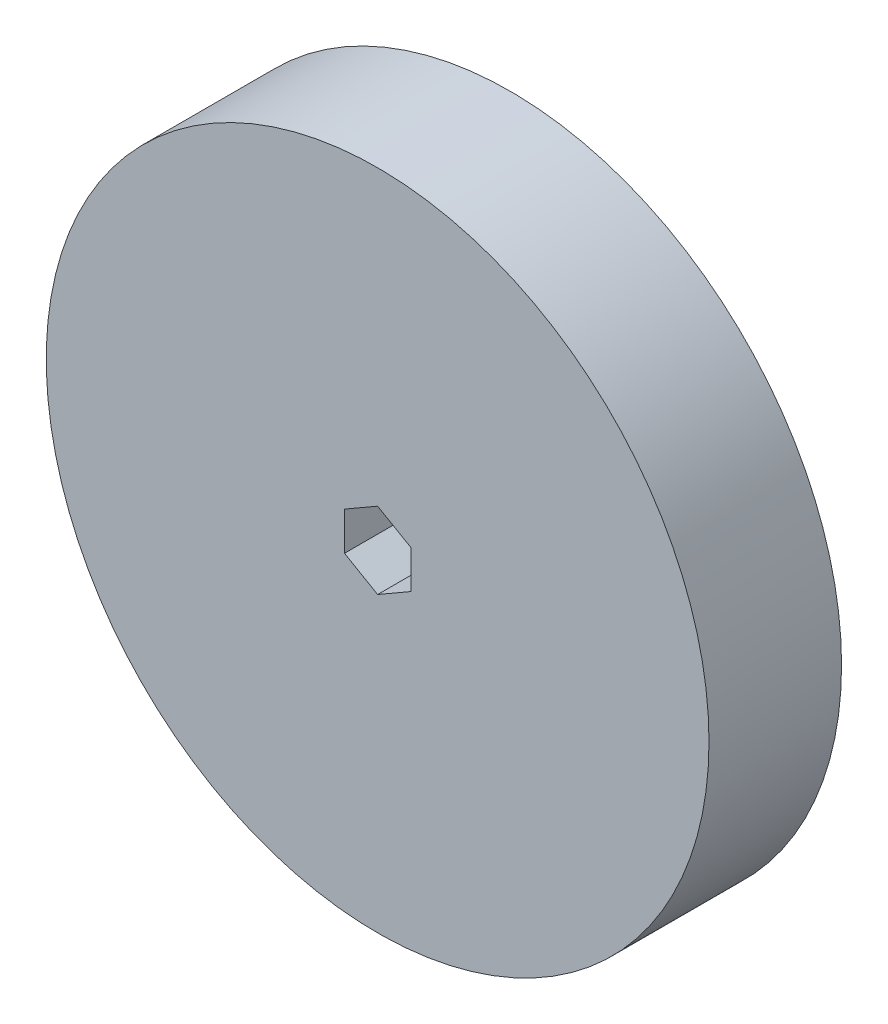
ISO-10303-21;
HEADER;
FILE_DESCRIPTION(('STEP AP214'),'2;1');
FILE_NAME('part.step','',(''),(''),'','','');
FILE_SCHEMA(('AUTOMOTIVE_DESIGN { 1 0 10303 214 1 1 1 1 }'));
ENDSEC;
DATA;
#1=APPLICATION_CONTEXT('core data for automotive mechanical design processes');
#2=APPLICATION_PROTOCOL_DEFINITION('international standard','automotive_design',2000,#1);
#3=PRODUCT_CONTEXT('',#1,'mechanical');
#4=PRODUCT('Part','Part','',(#3));
#5=PRODUCT_RELATED_PRODUCT_CATEGORY('part','',(#4));
#6=PRODUCT_DEFINITION_FORMATION('','',#4);
#7=PRODUCT_DEFINITION_CONTEXT('part definition',#1,'design');
#8=PRODUCT_DEFINITION('design','',#6,#7);
#9=PRODUCT_DEFINITION_SHAPE('','',#8);
#10=(LENGTH_UNIT() NAMED_UNIT(*) SI_UNIT(.MILLI.,.METRE.));
#11=(NAMED_UNIT(*) PLANE_ANGLE_UNIT() SI_UNIT($,.RADIAN.));
#12=(NAMED_UNIT(*) SI_UNIT($,.STERADIAN.) SOLID_ANGLE_UNIT());
#13=UNCERTAINTY_MEASURE_WITH_UNIT(LENGTH_MEASURE(1.E-05),#10,'distance_accuracy_value','');
#14=(GEOMETRIC_REPRESENTATION_CONTEXT(3) GLOBAL_UNCERTAINTY_ASSIGNED_CONTEXT((#13)) GLOBAL_UNIT_ASSIGNED_CONTEXT((#10,
#11,#12)) REPRESENTATION_CONTEXT('',''));
#15=CARTESIAN_POINT('',(0.,0.,0.));
#16=DIRECTION('',(0.,0.,1.));
#17=DIRECTION('',(1.,0.,0.));
#18=AXIS2_PLACEMENT_3D('',#15,#16,#17);
#19=CARTESIAN_POINT('',(0.,0.,25.4));
#20=DIRECTION('',(0.,0.,1.));
#21=DIRECTION('',(1.,0.,0.));
#22=AXIS2_PLACEMENT_3D('',#19,#20,#21);
#23=PLANE('',#22);
#24=CARTESIAN_POINT('',(0.,0.,25.4));
#25=DIRECTION('',(0.,0.,1.));
#26=DIRECTION('',(1.,0.,0.));
#27=AXIS2_PLACEMENT_3D('',#24,#25,#26);
#28=CIRCLE('',#27,63.5);
#29=CARTESIAN_POINT('',(63.5,0.,25.4));
#30=VERTEX_POINT('',#29);
#31=EDGE_CURVE('E11',#30,#30,#28,.T.);
#32=ORIENTED_EDGE('',*,*,#31,.T.);
#33=EDGE_LOOP('',(#32));
#34=FACE_BOUND('',#33,.T.);
#35=DIRECTION('',(-0.866025403784438,-0.5,0.));
#36=VECTOR('',#35,1.);
#37=CARTESIAN_POINT('',(0.,7.33234841870825,25.4));
#38=LINE('',#37,#36);
#39=CARTESIAN_POINT('',(0.,7.33234841870825,25.4));
#40=VERTEX_POINT('',#39);
#41=CARTESIAN_POINT('',(-6.34999999999999,3.66617420935413,25.4));
#42=VERTEX_POINT('',#41);
#43=EDGE_CURVE('E102',#40,#42,#38,.T.);
#44=ORIENTED_EDGE('',*,*,#43,.F.);
#45=DIRECTION('',(-0.866025403784439,0.5,0.));
#46=VECTOR('',#45,1.);
#47=CARTESIAN_POINT('',(6.34999999999997,3.66617420935414,25.4));
#48=LINE('',#47,#46);
#49=CARTESIAN_POINT('',(6.34999999999997,3.66617420935414,25.4));
#50=VERTEX_POINT('',#49);
#51=EDGE_CURVE('E93',#50,#40,#48,.T.);
#52=ORIENTED_EDGE('',*,*,#51,.F.);
#53=DIRECTION('',(0.,1.,0.));
#54=VECTOR('',#53,1.);
#55=CARTESIAN_POINT('',(6.34999999999998,-3.66617420935413,25.4));
#56=LINE('',#55,#54);
#57=CARTESIAN_POINT('',(6.34999999999998,-3.66617420935413,25.4));
#58=VERTEX_POINT('',#57);
#59=EDGE_CURVE('E127',#58,#50,#56,.T.);
#60=ORIENTED_EDGE('',*,*,#59,.F.);
#61=DIRECTION('',(0.866025403784439,0.5,0.));
#62=VECTOR('',#61,1.);
#63=CARTESIAN_POINT('',(0.,-7.33234841870824,25.4));
#64=LINE('',#63,#62);
#65=CARTESIAN_POINT('',(0.,-7.33234841870824,25.4));
#66=VERTEX_POINT('',#65);
#67=EDGE_CURVE('E124',#66,#58,#64,.T.);
#68=ORIENTED_EDGE('',*,*,#67,.F.);
#69=DIRECTION('',(0.866025403784439,-0.5,0.));
#70=VECTOR('',#69,1.);
#71=CARTESIAN_POINT('',(-6.34999999999999,-3.66617420935413,25.4));
#72=LINE('',#71,#70);
#73=CARTESIAN_POINT('',(-6.34999999999999,-3.66617420935413,25.4));
#74=VERTEX_POINT('',#73);
#75=EDGE_CURVE('E119',#74,#66,#72,.T.);
#76=ORIENTED_EDGE('',*,*,#75,.F.);
#77=DIRECTION('',(0.,-1.,0.));
#78=VECTOR('',#77,1.);
#79=CARTESIAN_POINT('',(-6.34999999999999,3.66617420935413,25.4));
#80=LINE('',#79,#78);
#81=EDGE_CURVE('E115',#42,#74,#80,.T.);
#82=ORIENTED_EDGE('',*,*,#81,.F.);
#83=EDGE_LOOP('',(#44,#52,#60,#68,#76,#82));
#84=FACE_BOUND('',#83,.T.);
#85=ADVANCED_FACE('F39',(#34,#84),#23,.T.);
#86=CARTESIAN_POINT('',(0.,0.,0.));
#87=DIRECTION('',(0.,0.,1.));
#88=DIRECTION('',(1.,0.,0.));
#89=AXIS2_PLACEMENT_3D('',#86,#87,#88);
#90=PLANE('',#89);
#91=CARTESIAN_POINT('',(0.,0.,0.));
#92=DIRECTION('',(0.,0.,1.));
#93=DIRECTION('',(1.,0.,0.));
#94=AXIS2_PLACEMENT_3D('',#91,#92,#93);
#95=CIRCLE('',#94,63.5);
#96=CARTESIAN_POINT('',(63.5,0.,0.));
#97=VERTEX_POINT('',#96);
#98=EDGE_CURVE('E43',#97,#97,#95,.T.);
#99=ORIENTED_EDGE('',*,*,#98,.F.);
#100=EDGE_LOOP('',(#99));
#101=FACE_BOUND('',#100,.T.);
#102=DIRECTION('',(-0.866025403784439,0.5,0.));
#103=VECTOR('',#102,1.);
#104=CARTESIAN_POINT('',(6.34999999999997,3.66617420935414,0.));
#105=LINE('',#104,#103);
#106=CARTESIAN_POINT('',(6.34999999999997,3.66617420935414,0.));
#107=VERTEX_POINT('',#106);
#108=CARTESIAN_POINT('',(0.,7.33234841870825,0.));
#109=VERTEX_POINT('',#108);
#110=EDGE_CURVE('E63',#107,#109,#105,.T.);
#111=ORIENTED_EDGE('',*,*,#110,.T.);
#112=DIRECTION('',(-0.866025403784438,-0.5,0.));
#113=VECTOR('',#112,1.);
#114=CARTESIAN_POINT('',(0.,7.33234841870825,0.));
#115=LINE('',#114,#113);
#116=CARTESIAN_POINT('',(-6.34999999999999,3.66617420935413,0.));
#117=VERTEX_POINT('',#116);
#118=EDGE_CURVE('E109',#109,#117,#115,.T.);
#119=ORIENTED_EDGE('',*,*,#118,.T.);
#120=DIRECTION('',(0.,-1.,0.));
#121=VECTOR('',#120,1.);
#122=CARTESIAN_POINT('',(-6.34999999999999,3.66617420935413,0.));
#123=LINE('',#122,#121);
#124=CARTESIAN_POINT('',(-6.34999999999999,-3.66617420935413,0.));
#125=VERTEX_POINT('',#124);
#126=EDGE_CURVE('E134',#117,#125,#123,.T.);
#127=ORIENTED_EDGE('',*,*,#126,.T.);
#128=DIRECTION('',(0.866025403784439,-0.5,0.));
#129=VECTOR('',#128,1.);
#130=CARTESIAN_POINT('',(-6.34999999999999,-3.66617420935413,0.));
#131=LINE('',#130,#129);
#132=CARTESIAN_POINT('',(0.,-7.33234841870824,0.));
#133=VERTEX_POINT('',#132);
#134=EDGE_CURVE('E138',#125,#133,#131,.T.);
#135=ORIENTED_EDGE('',*,*,#134,.T.);
#136=DIRECTION('',(0.866025403784439,0.5,0.));
#137=VECTOR('',#136,1.);
#138=CARTESIAN_POINT('',(0.,-7.33234841870824,0.));
#139=LINE('',#138,#137);
#140=CARTESIAN_POINT('',(6.34999999999998,-3.66617420935413,0.));
#141=VERTEX_POINT('',#140);
#142=EDGE_CURVE('E142',#133,#141,#139,.T.);
#143=ORIENTED_EDGE('',*,*,#142,.T.);
#144=DIRECTION('',(0.,1.,0.));
#145=VECTOR('',#144,1.);
#146=CARTESIAN_POINT('',(6.34999999999998,-3.66617420935413,0.));
#147=LINE('',#146,#145);
#148=EDGE_CURVE('E103',#141,#107,#147,.T.);
#149=ORIENTED_EDGE('',*,*,#148,.T.);
#150=EDGE_LOOP('',(#111,#119,#127,#135,#143,#149));
#151=FACE_BOUND('',#150,.T.);
#152=ADVANCED_FACE('F166',(#101,#151),#90,.F.);
#153=CARTESIAN_POINT('',(0.,0.,25.4));
#154=DIRECTION('',(0.,0.,-1.));
#155=DIRECTION('',(-1.,0.,0.));
#156=AXIS2_PLACEMENT_3D('',#153,#154,#155);
#157=CYLINDRICAL_SURFACE('',#156,63.5);
#158=ORIENTED_EDGE('',*,*,#31,.F.);
#159=EDGE_LOOP('',(#158));
#160=FACE_BOUND('',#159,.T.);
#161=ORIENTED_EDGE('',*,*,#98,.T.);
#162=EDGE_LOOP('',(#161));
#163=FACE_BOUND('',#162,.T.);
#164=ADVANCED_FACE('F41',(#160,#163),#157,.T.);
#165=CARTESIAN_POINT('',(6.34999999999997,3.66617420935414,25.4));
#166=DIRECTION('',(-0.5,-0.866025403784439,0.));
#167=DIRECTION('',(0.866025403784439,-0.5,0.));
#168=AXIS2_PLACEMENT_3D('',#165,#166,#167);
#169=PLANE('',#168);
#170=ORIENTED_EDGE('',*,*,#110,.F.);
#171=DIRECTION('',(0.,0.,-1.));
#172=VECTOR('',#171,1.);
#173=CARTESIAN_POINT('',(6.34999999999997,3.66617420935414,25.4));
#174=LINE('',#173,#172);
#175=EDGE_CURVE('E97',#50,#107,#174,.T.);
#176=ORIENTED_EDGE('',*,*,#175,.F.);
#177=ORIENTED_EDGE('',*,*,#51,.T.);
#178=DIRECTION('',(0.,0.,-1.));
#179=VECTOR('',#178,1.);
#180=CARTESIAN_POINT('',(0.,7.33234841870825,25.4));
#181=LINE('',#180,#179);
#182=EDGE_CURVE('E96',#40,#109,#181,.T.);
#183=ORIENTED_EDGE('',*,*,#182,.T.);
#184=EDGE_LOOP('',(#170,#176,#177,#183));
#185=FACE_BOUND('',#184,.T.);
#186=ADVANCED_FACE('F95',(#185),#169,.T.);
#187=CARTESIAN_POINT('',(0.,7.33234841870825,25.4));
#188=DIRECTION('',(0.5,-0.866025403784438,0.));
#189=DIRECTION('',(0.866025403784438,0.5,0.));
#190=AXIS2_PLACEMENT_3D('',#187,#188,#189);
#191=PLANE('',#190);
#192=ORIENTED_EDGE('',*,*,#118,.F.);
#193=ORIENTED_EDGE('',*,*,#182,.F.);
#194=ORIENTED_EDGE('',*,*,#43,.T.);
#195=DIRECTION('',(0.,0.,-1.));
#196=VECTOR('',#195,1.);
#197=CARTESIAN_POINT('',(-6.34999999999999,3.66617420935413,25.4));
#198=LINE('',#197,#196);
#199=EDGE_CURVE('E111',#42,#117,#198,.T.);
#200=ORIENTED_EDGE('',*,*,#199,.T.);
#201=EDGE_LOOP('',(#192,#193,#194,#200));
#202=FACE_BOUND('',#201,.T.);
#203=ADVANCED_FACE('F106',(#202),#191,.T.);
#204=CARTESIAN_POINT('',(-6.34999999999999,3.66617420935413,25.4));
#205=DIRECTION('',(1.,0.,0.));
#206=DIRECTION('',(0.,1.,0.));
#207=AXIS2_PLACEMENT_3D('',#204,#205,#206);
#208=PLANE('',#207);
#209=ORIENTED_EDGE('',*,*,#126,.F.);
#210=ORIENTED_EDGE('',*,*,#199,.F.);
#211=ORIENTED_EDGE('',*,*,#81,.T.);
#212=DIRECTION('',(0.,0.,-1.));
#213=VECTOR('',#212,1.);
#214=CARTESIAN_POINT('',(-6.34999999999999,-3.66617420935413,25.4));
#215=LINE('',#214,#213);
#216=EDGE_CURVE('E156',#74,#125,#215,.T.);
#217=ORIENTED_EDGE('',*,*,#216,.T.);
#218=EDGE_LOOP('',(#209,#210,#211,#217));
#219=FACE_BOUND('',#218,.T.);
#220=ADVANCED_FACE('F162',(#219),#208,.T.);
#221=CARTESIAN_POINT('',(-6.34999999999999,-3.66617420935413,25.4));
#222=DIRECTION('',(0.5,0.866025403784439,0.));
#223=DIRECTION('',(-0.866025403784439,0.5,0.));
#224=AXIS2_PLACEMENT_3D('',#221,#222,#223);
#225=PLANE('',#224);
#226=ORIENTED_EDGE('',*,*,#134,.F.);
#227=ORIENTED_EDGE('',*,*,#216,.F.);
#228=ORIENTED_EDGE('',*,*,#75,.T.);
#229=DIRECTION('',(0.,0.,-1.));
#230=VECTOR('',#229,1.);
#231=CARTESIAN_POINT('',(0.,-7.33234841870824,25.4));
#232=LINE('',#231,#230);
#233=EDGE_CURVE('E153',#66,#133,#232,.T.);
#234=ORIENTED_EDGE('',*,*,#233,.T.);
#235=EDGE_LOOP('',(#226,#227,#228,#234));
#236=FACE_BOUND('',#235,.T.);
#237=ADVANCED_FACE('F174',(#236),#225,.T.);
#238=CARTESIAN_POINT('',(0.,-7.33234841870824,25.4));
#239=DIRECTION('',(-0.5,0.866025403784439,0.));
#240=DIRECTION('',(-0.866025403784439,-0.5,0.));
#241=AXIS2_PLACEMENT_3D('',#238,#239,#240);
#242=PLANE('',#241);
#243=ORIENTED_EDGE('',*,*,#142,.F.);
#244=ORIENTED_EDGE('',*,*,#233,.F.);
#245=ORIENTED_EDGE('',*,*,#67,.T.);
#246=DIRECTION('',(0.,0.,-1.));
#247=VECTOR('',#246,1.);
#248=CARTESIAN_POINT('',(6.34999999999998,-3.66617420935413,25.4));
#249=LINE('',#248,#247);
#250=EDGE_CURVE('E55',#58,#141,#249,.T.);
#251=ORIENTED_EDGE('',*,*,#250,.T.);
#252=EDGE_LOOP('',(#243,#244,#245,#251));
#253=FACE_BOUND('',#252,.T.);
#254=ADVANCED_FACE('F172',(#253),#242,.T.);
#255=CARTESIAN_POINT('',(6.34999999999998,-3.66617420935413,25.4));
#256=DIRECTION('',(-1.,0.,0.));
#257=DIRECTION('',(0.,-1.,0.));
#258=AXIS2_PLACEMENT_3D('',#255,#256,#257);
#259=PLANE('',#258);
#260=ORIENTED_EDGE('',*,*,#148,.F.);
#261=ORIENTED_EDGE('',*,*,#250,.F.);
#262=ORIENTED_EDGE('',*,*,#59,.T.);
#263=ORIENTED_EDGE('',*,*,#175,.T.);
#264=EDGE_LOOP('',(#260,#261,#262,#263));
#265=FACE_BOUND('',#264,.T.);
#266=ADVANCED_FACE('F168',(#265),#259,.T.);
#267=CLOSED_SHELL('',(#85,#152,#164,#186,#203,#220,#237,#254,#266));
#268=MANIFOLD_SOLID_BREP('B2',#267);
#269=ADVANCED_BREP_SHAPE_REPRESENTATION('',(#18,#268),#14);
#270=SHAPE_DEFINITION_REPRESENTATION(#9,#269);
ENDSEC;
END-ISO-10303-21;
